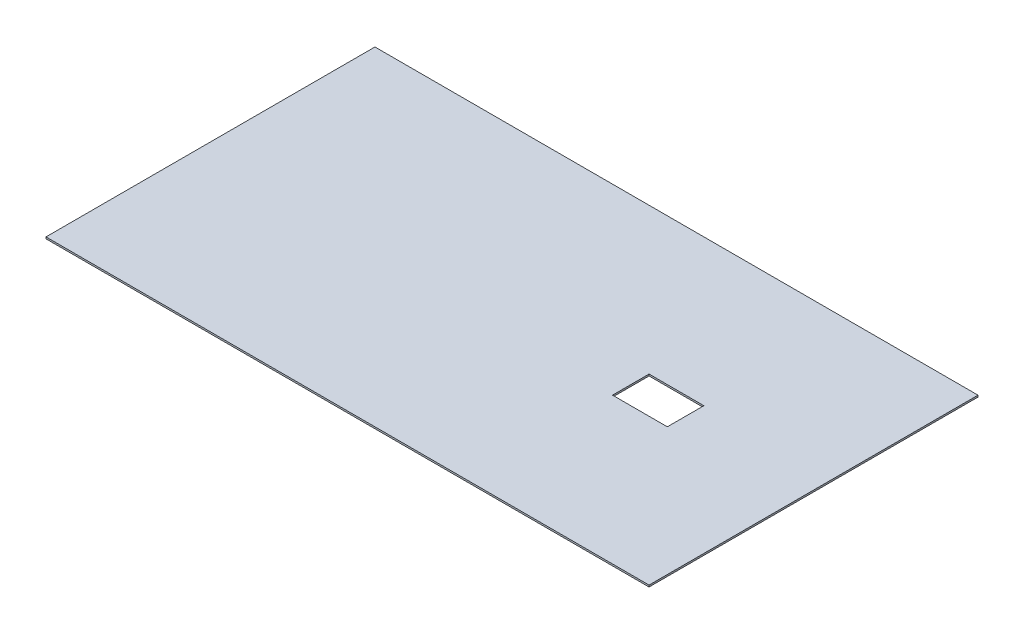
ISO-10303-21;
HEADER;
FILE_DESCRIPTION(('STEP AP214'),'2;1');
FILE_NAME('part.step','',(''),(''),'','','');
FILE_SCHEMA(('AUTOMOTIVE_DESIGN { 1 0 10303 214 1 1 1 1 }'));
ENDSEC;
DATA;
#1=APPLICATION_CONTEXT('core data for automotive mechanical design processes');
#2=APPLICATION_PROTOCOL_DEFINITION('international standard','automotive_design',2000,#1);
#3=PRODUCT_CONTEXT('',#1,'mechanical');
#4=PRODUCT('Part','Part','',(#3));
#5=PRODUCT_RELATED_PRODUCT_CATEGORY('part','',(#4));
#6=PRODUCT_DEFINITION_FORMATION('','',#4);
#7=PRODUCT_DEFINITION_CONTEXT('part definition',#1,'design');
#8=PRODUCT_DEFINITION('design','',#6,#7);
#9=PRODUCT_DEFINITION_SHAPE('','',#8);
#10=(LENGTH_UNIT() NAMED_UNIT(*) SI_UNIT(.MILLI.,.METRE.));
#11=(NAMED_UNIT(*) PLANE_ANGLE_UNIT() SI_UNIT($,.RADIAN.));
#12=(NAMED_UNIT(*) SI_UNIT($,.STERADIAN.) SOLID_ANGLE_UNIT());
#13=UNCERTAINTY_MEASURE_WITH_UNIT(LENGTH_MEASURE(1.E-05),#10,'distance_accuracy_value','');
#14=(GEOMETRIC_REPRESENTATION_CONTEXT(3) GLOBAL_UNCERTAINTY_ASSIGNED_CONTEXT((#13)) GLOBAL_UNIT_ASSIGNED_CONTEXT((#10,
#11,#12)) REPRESENTATION_CONTEXT('',''));
#15=CARTESIAN_POINT('',(0.,0.,0.));
#16=DIRECTION('',(0.,0.,1.));
#17=DIRECTION('',(1.,0.,0.));
#18=AXIS2_PLACEMENT_3D('',#15,#16,#17);
#19=CARTESIAN_POINT('',(0.,2.38125,0.));
#20=DIRECTION('',(1.,0.,0.));
#21=DIRECTION('',(0.,0.,-1.));
#22=AXIS2_PLACEMENT_3D('',#19,#20,#21);
#23=PLANE('',#22);
#24=DIRECTION('',(0.,0.,1.));
#25=VECTOR('',#24,1.);
#26=CARTESIAN_POINT('',(0.,0.,0.));
#27=LINE('',#26,#25);
#28=CARTESIAN_POINT('',(0.,0.,-457.2));
#29=VERTEX_POINT('',#28);
#30=CARTESIAN_POINT('',(0.,0.,0.));
#31=VERTEX_POINT('',#30);
#32=EDGE_CURVE('E134',#29,#31,#27,.T.);
#33=ORIENTED_EDGE('',*,*,#32,.T.);
#34=DIRECTION('',(0.,-1.,0.));
#35=VECTOR('',#34,1.);
#36=CARTESIAN_POINT('',(0.,2.38125,0.));
#37=LINE('',#36,#35);
#38=CARTESIAN_POINT('',(0.,2.38125,0.));
#39=VERTEX_POINT('',#38);
#40=EDGE_CURVE('E11',#39,#31,#37,.T.);
#41=ORIENTED_EDGE('',*,*,#40,.F.);
#42=DIRECTION('',(0.,0.,1.));
#43=VECTOR('',#42,1.);
#44=CARTESIAN_POINT('',(0.,2.38125,0.));
#45=LINE('',#44,#43);
#46=CARTESIAN_POINT('',(0.,2.38125,-457.2));
#47=VERTEX_POINT('',#46);
#48=EDGE_CURVE('E138',#47,#39,#45,.T.);
#49=ORIENTED_EDGE('',*,*,#48,.F.);
#50=DIRECTION('',(0.,-1.,0.));
#51=VECTOR('',#50,1.);
#52=CARTESIAN_POINT('',(0.,2.38125,-457.2));
#53=LINE('',#52,#51);
#54=EDGE_CURVE('E148',#47,#29,#53,.T.);
#55=ORIENTED_EDGE('',*,*,#54,.T.);
#56=EDGE_LOOP('',(#33,#41,#49,#55));
#57=FACE_BOUND('',#56,.T.);
#58=ADVANCED_FACE('F37',(#57),#23,.F.);
#59=CARTESIAN_POINT('',(0.,2.38125,0.));
#60=DIRECTION('',(0.,0.,-1.));
#61=DIRECTION('',(-1.,0.,0.));
#62=AXIS2_PLACEMENT_3D('',#59,#60,#61);
#63=PLANE('',#62);
#64=DIRECTION('',(1.,0.,0.));
#65=VECTOR('',#64,1.);
#66=CARTESIAN_POINT('',(0.,0.,0.));
#67=LINE('',#66,#65);
#68=CARTESIAN_POINT('',(838.2,0.,0.));
#69=VERTEX_POINT('',#68);
#70=EDGE_CURVE('E151',#31,#69,#67,.T.);
#71=ORIENTED_EDGE('',*,*,#70,.T.);
#72=DIRECTION('',(0.,-1.,0.));
#73=VECTOR('',#72,1.);
#74=CARTESIAN_POINT('',(838.2,2.38125,0.));
#75=LINE('',#74,#73);
#76=CARTESIAN_POINT('',(838.2,2.38125,0.));
#77=VERTEX_POINT('',#76);
#78=EDGE_CURVE('E44',#77,#69,#75,.T.);
#79=ORIENTED_EDGE('',*,*,#78,.F.);
#80=DIRECTION('',(1.,0.,0.));
#81=VECTOR('',#80,1.);
#82=CARTESIAN_POINT('',(0.,2.38125,0.));
#83=LINE('',#82,#81);
#84=EDGE_CURVE('E141',#39,#77,#83,.T.);
#85=ORIENTED_EDGE('',*,*,#84,.F.);
#86=ORIENTED_EDGE('',*,*,#40,.T.);
#87=EDGE_LOOP('',(#71,#79,#85,#86));
#88=FACE_BOUND('',#87,.T.);
#89=ADVANCED_FACE('F179',(#88),#63,.F.);
#90=CARTESIAN_POINT('',(838.2,2.38125,0.));
#91=DIRECTION('',(-1.,0.,0.));
#92=DIRECTION('',(0.,0.,1.));
#93=AXIS2_PLACEMENT_3D('',#90,#91,#92);
#94=PLANE('',#93);
#95=DIRECTION('',(0.,0.,-1.));
#96=VECTOR('',#95,1.);
#97=CARTESIAN_POINT('',(838.2,0.,0.));
#98=LINE('',#97,#96);
#99=CARTESIAN_POINT('',(838.2,0.,-457.2));
#100=VERTEX_POINT('',#99);
#101=EDGE_CURVE('E153',#69,#100,#98,.T.);
#102=ORIENTED_EDGE('',*,*,#101,.T.);
#103=DIRECTION('',(0.,-1.,0.));
#104=VECTOR('',#103,1.);
#105=CARTESIAN_POINT('',(838.2,2.38125,-457.2));
#106=LINE('',#105,#104);
#107=CARTESIAN_POINT('',(838.2,2.38125,-457.2));
#108=VERTEX_POINT('',#107);
#109=EDGE_CURVE('E158',#108,#100,#106,.T.);
#110=ORIENTED_EDGE('',*,*,#109,.F.);
#111=DIRECTION('',(0.,0.,-1.));
#112=VECTOR('',#111,1.);
#113=CARTESIAN_POINT('',(838.2,2.38125,0.));
#114=LINE('',#113,#112);
#115=EDGE_CURVE('E144',#77,#108,#114,.T.);
#116=ORIENTED_EDGE('',*,*,#115,.F.);
#117=ORIENTED_EDGE('',*,*,#78,.T.);
#118=EDGE_LOOP('',(#102,#110,#116,#117));
#119=FACE_BOUND('',#118,.T.);
#120=ADVANCED_FACE('F165',(#119),#94,.F.);
#121=CARTESIAN_POINT('',(0.,2.38125,-457.2));
#122=DIRECTION('',(0.,0.,1.));
#123=DIRECTION('',(1.,0.,0.));
#124=AXIS2_PLACEMENT_3D('',#121,#122,#123);
#125=PLANE('',#124);
#126=DIRECTION('',(-1.,0.,0.));
#127=VECTOR('',#126,1.);
#128=CARTESIAN_POINT('',(0.,0.,-457.2));
#129=LINE('',#128,#127);
#130=EDGE_CURVE('E142',#100,#29,#129,.T.);
#131=ORIENTED_EDGE('',*,*,#130,.T.);
#132=ORIENTED_EDGE('',*,*,#54,.F.);
#133=DIRECTION('',(-1.,0.,0.));
#134=VECTOR('',#133,1.);
#135=CARTESIAN_POINT('',(0.,2.38125,-457.2));
#136=LINE('',#135,#134);
#137=EDGE_CURVE('E146',#108,#47,#136,.T.);
#138=ORIENTED_EDGE('',*,*,#137,.F.);
#139=ORIENTED_EDGE('',*,*,#109,.T.);
#140=EDGE_LOOP('',(#131,#132,#138,#139));
#141=FACE_BOUND('',#140,.T.);
#142=ADVANCED_FACE('F172',(#141),#125,.F.);
#143=CARTESIAN_POINT('',(0.,2.38125,0.));
#144=DIRECTION('',(0.,-1.,0.));
#145=DIRECTION('',(0.,0.,-1.));
#146=AXIS2_PLACEMENT_3D('',#143,#144,#145);
#147=PLANE('',#146);
#148=DIRECTION('',(-1.,0.,0.));
#149=VECTOR('',#148,1.);
#150=CARTESIAN_POINT('',(660.400000000002,2.38125,-254.));
#151=LINE('',#150,#149);
#152=CARTESIAN_POINT('',(660.400000000002,2.38125,-254.));
#153=VERTEX_POINT('',#152);
#154=CARTESIAN_POINT('',(584.200000000002,2.38125,-254.));
#155=VERTEX_POINT('',#154);
#156=EDGE_CURVE('E128',#153,#155,#151,.T.);
#157=ORIENTED_EDGE('',*,*,#156,.F.);
#158=DIRECTION('',(0.,0.,-1.));
#159=VECTOR('',#158,1.);
#160=CARTESIAN_POINT('',(660.400000000002,2.38125,-254.));
#161=LINE('',#160,#159);
#162=CARTESIAN_POINT('',(660.400000000002,2.38125,-203.2));
#163=VERTEX_POINT('',#162);
#164=EDGE_CURVE('E51',#163,#153,#161,.T.);
#165=ORIENTED_EDGE('',*,*,#164,.F.);
#166=DIRECTION('',(1.,0.,0.));
#167=VECTOR('',#166,1.);
#168=CARTESIAN_POINT('',(660.400000000002,2.38125,-203.2));
#169=LINE('',#168,#167);
#170=CARTESIAN_POINT('',(584.200000000002,2.38125,-203.2));
#171=VERTEX_POINT('',#170);
#172=EDGE_CURVE('E119',#171,#163,#169,.T.);
#173=ORIENTED_EDGE('',*,*,#172,.F.);
#174=DIRECTION('',(0.,0.,1.));
#175=VECTOR('',#174,1.);
#176=CARTESIAN_POINT('',(584.200000000002,2.38125,-254.));
#177=LINE('',#176,#175);
#178=EDGE_CURVE('E122',#155,#171,#177,.T.);
#179=ORIENTED_EDGE('',*,*,#178,.F.);
#180=EDGE_LOOP('',(#157,#165,#173,#179));
#181=FACE_BOUND('',#180,.T.);
#182=ORIENTED_EDGE('',*,*,#48,.T.);
#183=ORIENTED_EDGE('',*,*,#84,.T.);
#184=ORIENTED_EDGE('',*,*,#115,.T.);
#185=ORIENTED_EDGE('',*,*,#137,.T.);
#186=EDGE_LOOP('',(#182,#183,#184,#185));
#187=FACE_BOUND('',#186,.T.);
#188=ADVANCED_FACE('F178',(#181,#187),#147,.F.);
#189=CARTESIAN_POINT('',(0.,0.,0.));
#190=DIRECTION('',(0.,-1.,0.));
#191=DIRECTION('',(0.,0.,-1.));
#192=AXIS2_PLACEMENT_3D('',#189,#190,#191);
#193=PLANE('',#192);
#194=DIRECTION('',(0.,0.,-1.));
#195=VECTOR('',#194,1.);
#196=CARTESIAN_POINT('',(660.400000000002,0.,-254.));
#197=LINE('',#196,#195);
#198=CARTESIAN_POINT('',(660.400000000002,0.,-203.2));
#199=VERTEX_POINT('',#198);
#200=CARTESIAN_POINT('',(660.400000000002,0.,-254.));
#201=VERTEX_POINT('',#200);
#202=EDGE_CURVE('E103',#199,#201,#197,.T.);
#203=ORIENTED_EDGE('',*,*,#202,.T.);
#204=DIRECTION('',(-1.,0.,0.));
#205=VECTOR('',#204,1.);
#206=CARTESIAN_POINT('',(660.400000000002,0.,-254.));
#207=LINE('',#206,#205);
#208=CARTESIAN_POINT('',(584.200000000002,0.,-254.));
#209=VERTEX_POINT('',#208);
#210=EDGE_CURVE('E112',#201,#209,#207,.T.);
#211=ORIENTED_EDGE('',*,*,#210,.T.);
#212=DIRECTION('',(0.,0.,1.));
#213=VECTOR('',#212,1.);
#214=CARTESIAN_POINT('',(584.200000000002,0.,-254.));
#215=LINE('',#214,#213);
#216=CARTESIAN_POINT('',(584.200000000002,0.,-203.2));
#217=VERTEX_POINT('',#216);
#218=EDGE_CURVE('E59',#209,#217,#215,.T.);
#219=ORIENTED_EDGE('',*,*,#218,.T.);
#220=DIRECTION('',(1.,0.,0.));
#221=VECTOR('',#220,1.);
#222=CARTESIAN_POINT('',(660.400000000002,0.,-203.2));
#223=LINE('',#222,#221);
#224=EDGE_CURVE('E109',#217,#199,#223,.T.);
#225=ORIENTED_EDGE('',*,*,#224,.T.);
#226=EDGE_LOOP('',(#203,#211,#219,#225));
#227=FACE_BOUND('',#226,.T.);
#228=ORIENTED_EDGE('',*,*,#32,.F.);
#229=ORIENTED_EDGE('',*,*,#130,.F.);
#230=ORIENTED_EDGE('',*,*,#101,.F.);
#231=ORIENTED_EDGE('',*,*,#70,.F.);
#232=EDGE_LOOP('',(#228,#229,#230,#231));
#233=FACE_BOUND('',#232,.T.);
#234=ADVANCED_FACE('F116',(#227,#233),#193,.T.);
#235=CARTESIAN_POINT('',(660.400000000002,0.,-254.));
#236=DIRECTION('',(1.,0.,0.));
#237=DIRECTION('',(0.,0.,-1.));
#238=AXIS2_PLACEMENT_3D('',#235,#236,#237);
#239=PLANE('',#238);
#240=ORIENTED_EDGE('',*,*,#164,.T.);
#241=DIRECTION('',(0.,1.,0.));
#242=VECTOR('',#241,1.);
#243=CARTESIAN_POINT('',(660.400000000002,0.,-254.));
#244=LINE('',#243,#242);
#245=EDGE_CURVE('E99',#201,#153,#244,.T.);
#246=ORIENTED_EDGE('',*,*,#245,.F.);
#247=ORIENTED_EDGE('',*,*,#202,.F.);
#248=DIRECTION('',(0.,1.,0.));
#249=VECTOR('',#248,1.);
#250=CARTESIAN_POINT('',(660.400000000002,0.,-203.2));
#251=LINE('',#250,#249);
#252=EDGE_CURVE('E132',#199,#163,#251,.T.);
#253=ORIENTED_EDGE('',*,*,#252,.T.);
#254=EDGE_LOOP('',(#240,#246,#247,#253));
#255=FACE_BOUND('',#254,.T.);
#256=ADVANCED_FACE('F101',(#255),#239,.F.);
#257=CARTESIAN_POINT('',(660.400000000002,0.,-203.2));
#258=DIRECTION('',(0.,0.,1.));
#259=DIRECTION('',(1.,0.,0.));
#260=AXIS2_PLACEMENT_3D('',#257,#258,#259);
#261=PLANE('',#260);
#262=ORIENTED_EDGE('',*,*,#172,.T.);
#263=ORIENTED_EDGE('',*,*,#252,.F.);
#264=ORIENTED_EDGE('',*,*,#224,.F.);
#265=DIRECTION('',(0.,1.,0.));
#266=VECTOR('',#265,1.);
#267=CARTESIAN_POINT('',(584.200000000002,0.,-203.2));
#268=LINE('',#267,#266);
#269=EDGE_CURVE('E135',#217,#171,#268,.T.);
#270=ORIENTED_EDGE('',*,*,#269,.T.);
#271=EDGE_LOOP('',(#262,#263,#264,#270));
#272=FACE_BOUND('',#271,.T.);
#273=ADVANCED_FACE('F196',(#272),#261,.F.);
#274=CARTESIAN_POINT('',(584.200000000002,0.,-254.));
#275=DIRECTION('',(-1.,0.,0.));
#276=DIRECTION('',(0.,0.,1.));
#277=AXIS2_PLACEMENT_3D('',#274,#275,#276);
#278=PLANE('',#277);
#279=ORIENTED_EDGE('',*,*,#178,.T.);
#280=ORIENTED_EDGE('',*,*,#269,.F.);
#281=ORIENTED_EDGE('',*,*,#218,.F.);
#282=DIRECTION('',(0.,1.,0.));
#283=VECTOR('',#282,1.);
#284=CARTESIAN_POINT('',(584.200000000002,0.,-254.));
#285=LINE('',#284,#283);
#286=EDGE_CURVE('E108',#209,#155,#285,.T.);
#287=ORIENTED_EDGE('',*,*,#286,.T.);
#288=EDGE_LOOP('',(#279,#280,#281,#287));
#289=FACE_BOUND('',#288,.T.);
#290=ADVANCED_FACE('F199',(#289),#278,.F.);
#291=CARTESIAN_POINT('',(660.400000000002,0.,-254.));
#292=DIRECTION('',(0.,0.,-1.));
#293=DIRECTION('',(-1.,0.,0.));
#294=AXIS2_PLACEMENT_3D('',#291,#292,#293);
#295=PLANE('',#294);
#296=ORIENTED_EDGE('',*,*,#156,.T.);
#297=ORIENTED_EDGE('',*,*,#286,.F.);
#298=ORIENTED_EDGE('',*,*,#210,.F.);
#299=ORIENTED_EDGE('',*,*,#245,.T.);
#300=EDGE_LOOP('',(#296,#297,#298,#299));
#301=FACE_BOUND('',#300,.T.);
#302=ADVANCED_FACE('F113',(#301),#295,.F.);
#303=CLOSED_SHELL('',(#58,#89,#120,#142,#188,#234,#256,#273,#290,#302));
#304=MANIFOLD_SOLID_BREP('B2',#303);
#305=ADVANCED_BREP_SHAPE_REPRESENTATION('',(#18,#304),#14);
#306=SHAPE_DEFINITION_REPRESENTATION(#9,#305);
ENDSEC;
END-ISO-10303-21;
